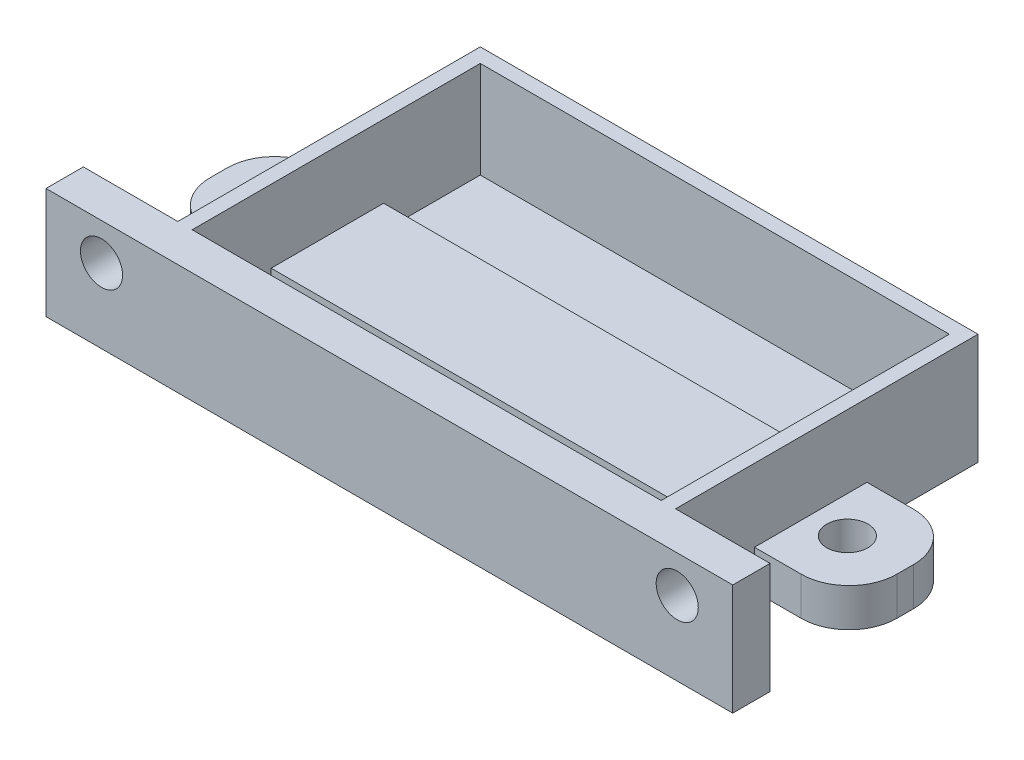
ISO-10303-21;
HEADER;
FILE_DESCRIPTION(('STEP AP214'),'2;1');
FILE_NAME('part.step','',(''),(''),'','','');
FILE_SCHEMA(('AUTOMOTIVE_DESIGN { 1 0 10303 214 1 1 1 1 }'));
ENDSEC;
DATA;
#1=APPLICATION_CONTEXT('core data for automotive mechanical design processes');
#2=APPLICATION_PROTOCOL_DEFINITION('international standard','automotive_design',2000,#1);
#3=PRODUCT_CONTEXT('',#1,'mechanical');
#4=PRODUCT('Part','Part','',(#3));
#5=PRODUCT_RELATED_PRODUCT_CATEGORY('part','',(#4));
#6=PRODUCT_DEFINITION_FORMATION('','',#4);
#7=PRODUCT_DEFINITION_CONTEXT('part definition',#1,'design');
#8=PRODUCT_DEFINITION('design','',#6,#7);
#9=PRODUCT_DEFINITION_SHAPE('','',#8);
#10=(LENGTH_UNIT() NAMED_UNIT(*) SI_UNIT(.MILLI.,.METRE.));
#11=(NAMED_UNIT(*) PLANE_ANGLE_UNIT() SI_UNIT($,.RADIAN.));
#12=(NAMED_UNIT(*) SI_UNIT($,.STERADIAN.) SOLID_ANGLE_UNIT());
#13=UNCERTAINTY_MEASURE_WITH_UNIT(LENGTH_MEASURE(1.E-05),#10,'distance_accuracy_value','');
#14=(GEOMETRIC_REPRESENTATION_CONTEXT(3) GLOBAL_UNCERTAINTY_ASSIGNED_CONTEXT((#13)) GLOBAL_UNIT_ASSIGNED_CONTEXT((#10,
#11,#12)) REPRESENTATION_CONTEXT('',''));
#15=CARTESIAN_POINT('',(0.,0.,0.));
#16=DIRECTION('',(0.,0.,1.));
#17=DIRECTION('',(1.,0.,0.));
#18=AXIS2_PLACEMENT_3D('',#15,#16,#17);
#19=CARTESIAN_POINT('',(0.,1.5,0.));
#20=DIRECTION('',(0.,1.,0.));
#21=DIRECTION('',(0.,0.,1.));
#22=AXIS2_PLACEMENT_3D('',#19,#20,#21);
#23=PLANE('',#22);
#24=DIRECTION('',(1.,0.,0.));
#25=VECTOR('',#24,1.);
#26=CARTESIAN_POINT('',(0.,1.5,5.59999999999999));
#27=LINE('',#26,#25);
#28=CARTESIAN_POINT('',(-24.5,1.5,5.59999999999999));
#29=VERTEX_POINT('',#28);
#30=CARTESIAN_POINT('',(24.5,1.5,5.59999999999999));
#31=VERTEX_POINT('',#30);
#32=EDGE_CURVE('E280',#29,#31,#27,.T.);
#33=ORIENTED_EDGE('',*,*,#32,.F.);
#34=DIRECTION('',(0.,0.,1.));
#35=VECTOR('',#34,1.);
#36=CARTESIAN_POINT('',(-24.5,1.5,17.75));
#37=LINE('',#36,#35);
#38=CARTESIAN_POINT('',(-24.5,1.5,13.85));
#39=VERTEX_POINT('',#38);
#40=EDGE_CURVE('E345',#29,#39,#37,.T.);
#41=ORIENTED_EDGE('',*,*,#40,.T.);
#42=DIRECTION('',(1.,0.,0.));
#43=VECTOR('',#42,1.);
#44=CARTESIAN_POINT('',(0.,1.5,13.85));
#45=LINE('',#44,#43);
#46=CARTESIAN_POINT('',(24.5,1.5,13.85));
#47=VERTEX_POINT('',#46);
#48=EDGE_CURVE('E387',#39,#47,#45,.T.);
#49=ORIENTED_EDGE('',*,*,#48,.T.);
#50=DIRECTION('',(0.,0.,-1.));
#51=VECTOR('',#50,1.);
#52=CARTESIAN_POINT('',(24.5,1.5,17.75));
#53=LINE('',#52,#51);
#54=EDGE_CURVE('E354',#47,#31,#53,.T.);
#55=ORIENTED_EDGE('',*,*,#54,.T.);
#56=EDGE_LOOP('',(#33,#41,#49,#55));
#57=FACE_BOUND('',#56,.T.);
#58=ADVANCED_FACE('F37',(#57),#23,.T.);
#59=CARTESIAN_POINT('',(-26.,11.6,17.75));
#60=DIRECTION('',(1.,0.,0.));
#61=DIRECTION('',(0.,0.,-1.));
#62=AXIS2_PLACEMENT_3D('',#59,#60,#61);
#63=PLANE('',#62);
#64=DIRECTION('',(0.,0.,-1.));
#65=VECTOR('',#64,1.);
#66=CARTESIAN_POINT('',(-26.,4.,17.75));
#67=LINE('',#66,#65);
#68=CARTESIAN_POINT('',(-26.,4.,5.6));
#69=VERTEX_POINT('',#68);
#70=CARTESIAN_POINT('',(-26.,4.,-6.15000000000001));
#71=VERTEX_POINT('',#70);
#72=EDGE_CURVE('E297',#69,#71,#67,.T.);
#73=ORIENTED_EDGE('',*,*,#72,.F.);
#74=DIRECTION('',(0.,-1.,0.));
#75=VECTOR('',#74,1.);
#76=CARTESIAN_POINT('',(-26.,11.6,5.59999999999999));
#77=LINE('',#76,#75);
#78=CARTESIAN_POINT('',(-26.,0.,5.59999999999999));
#79=VERTEX_POINT('',#78);
#80=EDGE_CURVE('E291',#69,#79,#77,.T.);
#81=ORIENTED_EDGE('',*,*,#80,.T.);
#82=DIRECTION('',(0.,0.,1.));
#83=VECTOR('',#82,1.);
#84=CARTESIAN_POINT('',(-26.,0.,17.75));
#85=LINE('',#84,#83);
#86=CARTESIAN_POINT('',(-26.,0.,13.85));
#87=VERTEX_POINT('',#86);
#88=EDGE_CURVE('E360',#79,#87,#85,.T.);
#89=ORIENTED_EDGE('',*,*,#88,.T.);
#90=DIRECTION('',(0.,-1.,0.));
#91=VECTOR('',#90,1.);
#92=CARTESIAN_POINT('',(-26.,11.6,13.85));
#93=LINE('',#92,#91);
#94=CARTESIAN_POINT('',(-26.,11.6,13.85));
#95=VERTEX_POINT('',#94);
#96=EDGE_CURVE('E342',#95,#87,#93,.T.);
#97=ORIENTED_EDGE('',*,*,#96,.F.);
#98=DIRECTION('',(0.,0.,1.));
#99=VECTOR('',#98,1.);
#100=CARTESIAN_POINT('',(-26.,11.6,17.75));
#101=LINE('',#100,#99);
#102=CARTESIAN_POINT('',(-26.,11.6,-17.75));
#103=VERTEX_POINT('',#102);
#104=EDGE_CURVE('E368',#103,#95,#101,.T.);
#105=ORIENTED_EDGE('',*,*,#104,.F.);
#106=DIRECTION('',(0.,-1.,0.));
#107=VECTOR('',#106,1.);
#108=CARTESIAN_POINT('',(-26.,11.6,-17.75));
#109=LINE('',#108,#107);
#110=CARTESIAN_POINT('',(-26.,0.,-17.75));
#111=VERTEX_POINT('',#110);
#112=EDGE_CURVE('E377',#103,#111,#109,.T.);
#113=ORIENTED_EDGE('',*,*,#112,.T.);
#114=CARTESIAN_POINT('',(-26.,0.,-6.15000000000001));
#115=VERTEX_POINT('',#114);
#116=EDGE_CURVE('E378',#111,#115,#85,.T.);
#117=ORIENTED_EDGE('',*,*,#116,.T.);
#118=DIRECTION('',(0.,1.,0.));
#119=VECTOR('',#118,1.);
#120=CARTESIAN_POINT('',(-26.,11.6,-6.15000000000001));
#121=LINE('',#120,#119);
#122=EDGE_CURVE('E248',#115,#71,#121,.T.);
#123=ORIENTED_EDGE('',*,*,#122,.T.);
#124=EDGE_LOOP('',(#73,#81,#89,#97,#105,#113,#117,#123));
#125=FACE_BOUND('',#124,.T.);
#126=ADVANCED_FACE('F479',(#125),#63,.F.);
#127=CARTESIAN_POINT('',(26.,11.6,17.75));
#128=DIRECTION('',(-1.,0.,0.));
#129=DIRECTION('',(0.,0.,1.));
#130=AXIS2_PLACEMENT_3D('',#127,#128,#129);
#131=PLANE('',#130);
#132=DIRECTION('',(0.,0.,-1.));
#133=VECTOR('',#132,1.);
#134=CARTESIAN_POINT('',(26.,0.,17.75));
#135=LINE('',#134,#133);
#136=CARTESIAN_POINT('',(26.,0.,13.85));
#137=VERTEX_POINT('',#136);
#138=CARTESIAN_POINT('',(26.,0.,5.59999999999999));
#139=VERTEX_POINT('',#138);
#140=EDGE_CURVE('E235',#137,#139,#135,.T.);
#141=ORIENTED_EDGE('',*,*,#140,.T.);
#142=DIRECTION('',(0.,1.,0.));
#143=VECTOR('',#142,1.);
#144=CARTESIAN_POINT('',(26.,11.6,5.6));
#145=LINE('',#144,#143);
#146=CARTESIAN_POINT('',(26.,4.,5.6));
#147=VERTEX_POINT('',#146);
#148=EDGE_CURVE('E289',#139,#147,#145,.T.);
#149=ORIENTED_EDGE('',*,*,#148,.T.);
#150=DIRECTION('',(0.,0.,1.));
#151=VECTOR('',#150,1.);
#152=CARTESIAN_POINT('',(26.,4.,17.75));
#153=LINE('',#152,#151);
#154=CARTESIAN_POINT('',(26.,4.,-6.15000000000001));
#155=VERTEX_POINT('',#154);
#156=EDGE_CURVE('E244',#155,#147,#153,.T.);
#157=ORIENTED_EDGE('',*,*,#156,.F.);
#158=DIRECTION('',(0.,-1.,0.));
#159=VECTOR('',#158,1.);
#160=CARTESIAN_POINT('',(26.,11.6,-6.15));
#161=LINE('',#160,#159);
#162=CARTESIAN_POINT('',(26.,0.,-6.15));
#163=VERTEX_POINT('',#162);
#164=EDGE_CURVE('E239',#155,#163,#161,.T.);
#165=ORIENTED_EDGE('',*,*,#164,.T.);
#166=CARTESIAN_POINT('',(26.,0.,-17.75));
#167=VERTEX_POINT('',#166);
#168=EDGE_CURVE('E224',#163,#167,#135,.T.);
#169=ORIENTED_EDGE('',*,*,#168,.T.);
#170=DIRECTION('',(0.,-1.,0.));
#171=VECTOR('',#170,1.);
#172=CARTESIAN_POINT('',(26.,11.6,-17.75));
#173=LINE('',#172,#171);
#174=CARTESIAN_POINT('',(26.,11.6,-17.75));
#175=VERTEX_POINT('',#174);
#176=EDGE_CURVE('E385',#175,#167,#173,.T.);
#177=ORIENTED_EDGE('',*,*,#176,.F.);
#178=DIRECTION('',(0.,0.,-1.));
#179=VECTOR('',#178,1.);
#180=CARTESIAN_POINT('',(26.,11.6,17.75));
#181=LINE('',#180,#179);
#182=CARTESIAN_POINT('',(26.,11.6,13.85));
#183=VERTEX_POINT('',#182);
#184=EDGE_CURVE('E373',#183,#175,#181,.T.);
#185=ORIENTED_EDGE('',*,*,#184,.F.);
#186=DIRECTION('',(0.,1.,0.));
#187=VECTOR('',#186,1.);
#188=CARTESIAN_POINT('',(26.,11.6,13.85));
#189=LINE('',#188,#187);
#190=EDGE_CURVE('E339',#137,#183,#189,.T.);
#191=ORIENTED_EDGE('',*,*,#190,.F.);
#192=EDGE_LOOP('',(#141,#149,#157,#165,#169,#177,#185,#191));
#193=FACE_BOUND('',#192,.T.);
#194=ADVANCED_FACE('F241',(#193),#131,.F.);
#195=CARTESIAN_POINT('',(-24.5,11.6,17.75));
#196=DIRECTION('',(1.,0.,0.));
#197=DIRECTION('',(0.,0.,-1.));
#198=AXIS2_PLACEMENT_3D('',#195,#196,#197);
#199=PLANE('',#198);
#200=DIRECTION('',(0.,-1.,0.));
#201=VECTOR('',#200,1.);
#202=CARTESIAN_POINT('',(-24.5,11.6,5.59999999999999));
#203=LINE('',#202,#201);
#204=CARTESIAN_POINT('',(-24.5,4.,5.6));
#205=VERTEX_POINT('',#204);
#206=EDGE_CURVE('E286',#205,#29,#203,.T.);
#207=ORIENTED_EDGE('',*,*,#206,.F.);
#208=DIRECTION('',(0.,0.,-1.));
#209=VECTOR('',#208,1.);
#210=CARTESIAN_POINT('',(-24.5,4.,17.75));
#211=LINE('',#210,#209);
#212=CARTESIAN_POINT('',(-24.5,4.,-6.15000000000001));
#213=VERTEX_POINT('',#212);
#214=EDGE_CURVE('E294',#205,#213,#211,.T.);
#215=ORIENTED_EDGE('',*,*,#214,.T.);
#216=DIRECTION('',(0.,1.,0.));
#217=VECTOR('',#216,1.);
#218=CARTESIAN_POINT('',(-24.5,11.6,-6.15000000000001));
#219=LINE('',#218,#217);
#220=CARTESIAN_POINT('',(-24.5,1.5,-6.15000000000001));
#221=VERTEX_POINT('',#220);
#222=EDGE_CURVE('E249',#221,#213,#219,.T.);
#223=ORIENTED_EDGE('',*,*,#222,.F.);
#224=CARTESIAN_POINT('',(-24.5,1.5,-16.25));
#225=VERTEX_POINT('',#224);
#226=EDGE_CURVE('E346',#225,#221,#37,.T.);
#227=ORIENTED_EDGE('',*,*,#226,.F.);
#228=DIRECTION('',(0.,-1.,0.));
#229=VECTOR('',#228,1.);
#230=CARTESIAN_POINT('',(-24.5,11.6,-16.25));
#231=LINE('',#230,#229);
#232=CARTESIAN_POINT('',(-24.5,11.6,-16.25));
#233=VERTEX_POINT('',#232);
#234=EDGE_CURVE('E349',#233,#225,#231,.T.);
#235=ORIENTED_EDGE('',*,*,#234,.F.);
#236=DIRECTION('',(0.,0.,1.));
#237=VECTOR('',#236,1.);
#238=CARTESIAN_POINT('',(-24.5,11.6,17.75));
#239=LINE('',#238,#237);
#240=CARTESIAN_POINT('',(-24.5,11.6,13.85));
#241=VERTEX_POINT('',#240);
#242=EDGE_CURVE('E362',#233,#241,#239,.T.);
#243=ORIENTED_EDGE('',*,*,#242,.T.);
#244=DIRECTION('',(0.,-1.,0.));
#245=VECTOR('',#244,1.);
#246=CARTESIAN_POINT('',(-24.5,11.6,13.85));
#247=LINE('',#246,#245);
#248=EDGE_CURVE('E336',#241,#39,#247,.T.);
#249=ORIENTED_EDGE('',*,*,#248,.T.);
#250=ORIENTED_EDGE('',*,*,#40,.F.);
#251=EDGE_LOOP('',(#207,#215,#223,#227,#235,#243,#249,#250));
#252=FACE_BOUND('',#251,.T.);
#253=ADVANCED_FACE('F521',(#252),#199,.T.);
#254=CARTESIAN_POINT('',(24.5,11.6,17.75));
#255=DIRECTION('',(-1.,0.,0.));
#256=DIRECTION('',(0.,0.,1.));
#257=AXIS2_PLACEMENT_3D('',#254,#255,#256);
#258=PLANE('',#257);
#259=DIRECTION('',(0.,1.,0.));
#260=VECTOR('',#259,1.);
#261=CARTESIAN_POINT('',(24.5,11.6,5.6));
#262=LINE('',#261,#260);
#263=CARTESIAN_POINT('',(24.5,4.,5.6));
#264=VERTEX_POINT('',#263);
#265=EDGE_CURVE('E283',#31,#264,#262,.T.);
#266=ORIENTED_EDGE('',*,*,#265,.F.);
#267=ORIENTED_EDGE('',*,*,#54,.F.);
#268=DIRECTION('',(0.,1.,0.));
#269=VECTOR('',#268,1.);
#270=CARTESIAN_POINT('',(24.5,11.6,13.85));
#271=LINE('',#270,#269);
#272=CARTESIAN_POINT('',(24.5,11.6,13.85));
#273=VERTEX_POINT('',#272);
#274=EDGE_CURVE('E325',#47,#273,#271,.T.);
#275=ORIENTED_EDGE('',*,*,#274,.T.);
#276=DIRECTION('',(0.,0.,-1.));
#277=VECTOR('',#276,1.);
#278=CARTESIAN_POINT('',(24.5,11.6,17.75));
#279=LINE('',#278,#277);
#280=CARTESIAN_POINT('',(24.5,11.6,-16.25));
#281=VERTEX_POINT('',#280);
#282=EDGE_CURVE('E365',#273,#281,#279,.T.);
#283=ORIENTED_EDGE('',*,*,#282,.T.);
#284=DIRECTION('',(0.,-1.,0.));
#285=VECTOR('',#284,1.);
#286=CARTESIAN_POINT('',(24.5,11.6,-16.25));
#287=LINE('',#286,#285);
#288=CARTESIAN_POINT('',(24.5,1.5,-16.25));
#289=VERTEX_POINT('',#288);
#290=EDGE_CURVE('E352',#281,#289,#287,.T.);
#291=ORIENTED_EDGE('',*,*,#290,.T.);
#292=CARTESIAN_POINT('',(24.5,1.5,-6.15000000000001));
#293=VERTEX_POINT('',#292);
#294=EDGE_CURVE('E348',#293,#289,#53,.T.);
#295=ORIENTED_EDGE('',*,*,#294,.F.);
#296=DIRECTION('',(0.,-1.,0.));
#297=VECTOR('',#296,1.);
#298=CARTESIAN_POINT('',(24.5,11.6,-6.15));
#299=LINE('',#298,#297);
#300=CARTESIAN_POINT('',(24.5,4.,-6.15000000000001));
#301=VERTEX_POINT('',#300);
#302=EDGE_CURVE('E272',#301,#293,#299,.T.);
#303=ORIENTED_EDGE('',*,*,#302,.F.);
#304=DIRECTION('',(0.,0.,1.));
#305=VECTOR('',#304,1.);
#306=CARTESIAN_POINT('',(24.5,4.,17.75));
#307=LINE('',#306,#305);
#308=EDGE_CURVE('E390',#301,#264,#307,.T.);
#309=ORIENTED_EDGE('',*,*,#308,.T.);
#310=EDGE_LOOP('',(#266,#267,#275,#283,#291,#295,#303,#309));
#311=FACE_BOUND('',#310,.T.);
#312=ADVANCED_FACE('F512',(#311),#258,.T.);
#313=DIRECTION('',(-1.,0.,0.));
#314=VECTOR('',#313,1.);
#315=CARTESIAN_POINT('',(0.,1.5,-6.15000000000001));
#316=LINE('',#315,#314);
#317=EDGE_CURVE('E269',#293,#221,#316,.T.);
#318=ORIENTED_EDGE('',*,*,#317,.F.);
#319=ORIENTED_EDGE('',*,*,#294,.T.);
#320=DIRECTION('',(-1.,0.,0.));
#321=VECTOR('',#320,1.);
#322=CARTESIAN_POINT('',(26.,1.5,-16.25));
#323=LINE('',#322,#321);
#324=EDGE_CURVE('E357',#289,#225,#323,.T.);
#325=ORIENTED_EDGE('',*,*,#324,.T.);
#326=ORIENTED_EDGE('',*,*,#226,.T.);
#327=EDGE_LOOP('',(#318,#319,#325,#326));
#328=FACE_BOUND('',#327,.T.);
#329=ADVANCED_FACE('F503',(#328),#23,.T.);
#330=CARTESIAN_POINT('',(26.,11.6,17.75));
#331=DIRECTION('',(0.,0.,-1.));
#332=DIRECTION('',(-1.,0.,0.));
#333=AXIS2_PLACEMENT_3D('',#330,#331,#332);
#334=PLANE('',#333);
#335=CARTESIAN_POINT('',(-30.0750000000001,7.75,17.75));
#336=DIRECTION('',(0.,0.,1.));
#337=DIRECTION('',(1.,0.,0.));
#338=AXIS2_PLACEMENT_3D('',#335,#336,#337);
#339=CIRCLE('',#338,2.2);
#340=CARTESIAN_POINT('',(-27.8750000000001,7.75,17.75));
#341=VERTEX_POINT('',#340);
#342=EDGE_CURVE('E423',#341,#341,#339,.T.);
#343=ORIENTED_EDGE('',*,*,#342,.F.);
#344=EDGE_LOOP('',(#343));
#345=FACE_BOUND('',#344,.T.);
#346=CARTESIAN_POINT('',(30.0750000000001,7.75,17.75));
#347=DIRECTION('',(0.,0.,1.));
#348=DIRECTION('',(1.,0.,0.));
#349=AXIS2_PLACEMENT_3D('',#346,#347,#348);
#350=CIRCLE('',#349,2.19999999999999);
#351=CARTESIAN_POINT('',(32.2750000000001,7.75,17.75));
#352=VERTEX_POINT('',#351);
#353=EDGE_CURVE('E429',#352,#352,#350,.T.);
#354=ORIENTED_EDGE('',*,*,#353,.F.);
#355=EDGE_LOOP('',(#354));
#356=FACE_BOUND('',#355,.T.);
#357=DIRECTION('',(1.,0.,0.));
#358=VECTOR('',#357,1.);
#359=CARTESIAN_POINT('',(26.,0.,17.75));
#360=LINE('',#359,#358);
#361=CARTESIAN_POINT('',(-35.875,0.,17.75));
#362=VERTEX_POINT('',#361);
#363=CARTESIAN_POINT('',(35.875,0.,17.75));
#364=VERTEX_POINT('',#363);
#365=EDGE_CURVE('E236',#362,#364,#360,.T.);
#366=ORIENTED_EDGE('',*,*,#365,.T.);
#367=DIRECTION('',(0.,1.,0.));
#368=VECTOR('',#367,1.);
#369=CARTESIAN_POINT('',(35.875,0.,17.75));
#370=LINE('',#369,#368);
#371=CARTESIAN_POINT('',(35.875,11.6,17.75));
#372=VERTEX_POINT('',#371);
#373=EDGE_CURVE('E305',#364,#372,#370,.T.);
#374=ORIENTED_EDGE('',*,*,#373,.T.);
#375=DIRECTION('',(1.,0.,0.));
#376=VECTOR('',#375,1.);
#377=CARTESIAN_POINT('',(26.,11.6,17.75));
#378=LINE('',#377,#376);
#379=CARTESIAN_POINT('',(-35.875,11.6,17.75));
#380=VERTEX_POINT('',#379);
#381=EDGE_CURVE('E371',#380,#372,#378,.T.);
#382=ORIENTED_EDGE('',*,*,#381,.F.);
#383=DIRECTION('',(0.,-1.,0.));
#384=VECTOR('',#383,1.);
#385=CARTESIAN_POINT('',(-35.875,0.,17.75));
#386=LINE('',#385,#384);
#387=EDGE_CURVE('E300',#380,#362,#386,.T.);
#388=ORIENTED_EDGE('',*,*,#387,.T.);
#389=EDGE_LOOP('',(#366,#374,#382,#388));
#390=FACE_BOUND('',#389,.T.);
#391=ADVANCED_FACE('F511',(#345,#356,#390),#334,.F.);
#392=CARTESIAN_POINT('',(26.,11.6,-17.75));
#393=DIRECTION('',(0.,0.,1.));
#394=DIRECTION('',(1.,0.,0.));
#395=AXIS2_PLACEMENT_3D('',#392,#393,#394);
#396=PLANE('',#395);
#397=DIRECTION('',(-1.,0.,0.));
#398=VECTOR('',#397,1.);
#399=CARTESIAN_POINT('',(26.,0.,-17.75));
#400=LINE('',#399,#398);
#401=EDGE_CURVE('E231',#167,#111,#400,.T.);
#402=ORIENTED_EDGE('',*,*,#401,.T.);
#403=ORIENTED_EDGE('',*,*,#112,.F.);
#404=DIRECTION('',(-1.,0.,0.));
#405=VECTOR('',#404,1.);
#406=CARTESIAN_POINT('',(26.,11.6,-17.75));
#407=LINE('',#406,#405);
#408=EDGE_CURVE('E375',#175,#103,#407,.T.);
#409=ORIENTED_EDGE('',*,*,#408,.F.);
#410=ORIENTED_EDGE('',*,*,#176,.T.);
#411=EDGE_LOOP('',(#402,#403,#409,#410));
#412=FACE_BOUND('',#411,.T.);
#413=ADVANCED_FACE('F518',(#412),#396,.F.);
#414=CARTESIAN_POINT('',(0.,11.6,0.));
#415=DIRECTION('',(0.,1.,0.));
#416=DIRECTION('',(0.,0.,1.));
#417=AXIS2_PLACEMENT_3D('',#414,#415,#416);
#418=PLANE('',#417);
#419=DIRECTION('',(-1.,0.,0.));
#420=VECTOR('',#419,1.);
#421=CARTESIAN_POINT('',(35.875,11.6,13.85));
#422=LINE('',#421,#420);
#423=EDGE_CURVE('E317',#273,#241,#422,.T.);
#424=ORIENTED_EDGE('',*,*,#423,.T.);
#425=ORIENTED_EDGE('',*,*,#242,.F.);
#426=DIRECTION('',(-1.,0.,0.));
#427=VECTOR('',#426,1.);
#428=CARTESIAN_POINT('',(26.,11.6,-16.25));
#429=LINE('',#428,#427);
#430=EDGE_CURVE('E353',#281,#233,#429,.T.);
#431=ORIENTED_EDGE('',*,*,#430,.F.);
#432=ORIENTED_EDGE('',*,*,#282,.F.);
#433=EDGE_LOOP('',(#424,#425,#431,#432));
#434=FACE_BOUND('',#433,.T.);
#435=ORIENTED_EDGE('',*,*,#104,.T.);
#436=CARTESIAN_POINT('',(-35.875,11.6,13.85));
#437=VERTEX_POINT('',#436);
#438=EDGE_CURVE('E312',#95,#437,#422,.T.);
#439=ORIENTED_EDGE('',*,*,#438,.T.);
#440=DIRECTION('',(0.,0.,1.));
#441=VECTOR('',#440,1.);
#442=CARTESIAN_POINT('',(-35.875,11.6,13.85));
#443=LINE('',#442,#441);
#444=EDGE_CURVE('E322',#437,#380,#443,.T.);
#445=ORIENTED_EDGE('',*,*,#444,.T.);
#446=ORIENTED_EDGE('',*,*,#381,.T.);
#447=DIRECTION('',(0.,0.,1.));
#448=VECTOR('',#447,1.);
#449=CARTESIAN_POINT('',(35.875,11.6,13.85));
#450=LINE('',#449,#448);
#451=CARTESIAN_POINT('',(35.875,11.6,13.85));
#452=VERTEX_POINT('',#451);
#453=EDGE_CURVE('E326',#452,#372,#450,.T.);
#454=ORIENTED_EDGE('',*,*,#453,.F.);
#455=EDGE_CURVE('E313',#452,#183,#422,.T.);
#456=ORIENTED_EDGE('',*,*,#455,.T.);
#457=ORIENTED_EDGE('',*,*,#184,.T.);
#458=ORIENTED_EDGE('',*,*,#408,.T.);
#459=EDGE_LOOP('',(#435,#439,#445,#446,#454,#456,#457,#458));
#460=FACE_BOUND('',#459,.T.);
#461=ADVANCED_FACE('F567',(#434,#460),#418,.T.);
#462=CARTESIAN_POINT('',(0.,0.,0.));
#463=DIRECTION('',(0.,1.,0.));
#464=DIRECTION('',(0.,0.,1.));
#465=AXIS2_PLACEMENT_3D('',#462,#463,#464);
#466=PLANE('',#465);
#467=CARTESIAN_POINT('',(-29.825,0.,-0.275000000000025));
#468=DIRECTION('',(0.,1.,0.));
#469=DIRECTION('',(0.,0.,1.));
#470=AXIS2_PLACEMENT_3D('',#467,#468,#469);
#471=CIRCLE('',#470,2.15);
#472=CARTESIAN_POINT('',(-29.825,0.,1.87499999999997));
#473=VERTEX_POINT('',#472);
#474=EDGE_CURVE('E260',#473,#473,#471,.T.);
#475=ORIENTED_EDGE('',*,*,#474,.T.);
#476=EDGE_LOOP('',(#475));
#477=FACE_BOUND('',#476,.T.);
#478=CARTESIAN_POINT('',(29.825,0.,-0.275000000000025));
#479=DIRECTION('',(0.,1.,0.));
#480=DIRECTION('',(0.,0.,1.));
#481=AXIS2_PLACEMENT_3D('',#478,#479,#480);
#482=CIRCLE('',#481,2.15);
#483=CARTESIAN_POINT('',(29.825,0.,1.87499999999998));
#484=VERTEX_POINT('',#483);
#485=EDGE_CURVE('E427',#484,#484,#482,.T.);
#486=ORIENTED_EDGE('',*,*,#485,.T.);
#487=EDGE_LOOP('',(#486));
#488=FACE_BOUND('',#487,.T.);
#489=DIRECTION('',(0.,0.,1.));
#490=VECTOR('',#489,1.);
#491=CARTESIAN_POINT('',(35.875,0.,-6.15));
#492=LINE('',#491,#490);
#493=CARTESIAN_POINT('',(35.875,0.,-1.15));
#494=VERTEX_POINT('',#493);
#495=CARTESIAN_POINT('',(35.875,0.,0.599999999999996));
#496=VERTEX_POINT('',#495);
#497=EDGE_CURVE('E258',#494,#496,#492,.T.);
#498=ORIENTED_EDGE('',*,*,#497,.T.);
#499=CARTESIAN_POINT('',(30.875,0.,0.599999999999996));
#500=DIRECTION('',(0.,1.,0.));
#501=DIRECTION('',(0.,0.,1.));
#502=AXIS2_PLACEMENT_3D('',#499,#500,#501);
#503=CIRCLE('',#502,5.);
#504=CARTESIAN_POINT('',(30.875,0.,5.6));
#505=VERTEX_POINT('',#504);
#506=EDGE_CURVE('E403',#496,#505,#503,.F.);
#507=ORIENTED_EDGE('',*,*,#506,.T.);
#508=DIRECTION('',(-1.,0.,0.));
#509=VECTOR('',#508,1.);
#510=CARTESIAN_POINT('',(35.875,0.,5.6));
#511=LINE('',#510,#509);
#512=EDGE_CURVE('E266',#505,#139,#511,.T.);
#513=ORIENTED_EDGE('',*,*,#512,.T.);
#514=ORIENTED_EDGE('',*,*,#140,.F.);
#515=DIRECTION('',(1.,0.,0.));
#516=VECTOR('',#515,1.);
#517=CARTESIAN_POINT('',(35.875,0.,13.85));
#518=LINE('',#517,#516);
#519=CARTESIAN_POINT('',(35.875,0.,13.85));
#520=VERTEX_POINT('',#519);
#521=EDGE_CURVE('E304',#137,#520,#518,.T.);
#522=ORIENTED_EDGE('',*,*,#521,.T.);
#523=DIRECTION('',(0.,0.,1.));
#524=VECTOR('',#523,1.);
#525=CARTESIAN_POINT('',(35.875,0.,13.85));
#526=LINE('',#525,#524);
#527=EDGE_CURVE('E329',#520,#364,#526,.T.);
#528=ORIENTED_EDGE('',*,*,#527,.T.);
#529=ORIENTED_EDGE('',*,*,#365,.F.);
#530=DIRECTION('',(0.,0.,1.));
#531=VECTOR('',#530,1.);
#532=CARTESIAN_POINT('',(-35.875,0.,13.85));
#533=LINE('',#532,#531);
#534=CARTESIAN_POINT('',(-35.875,0.,13.85));
#535=VERTEX_POINT('',#534);
#536=EDGE_CURVE('E316',#535,#362,#533,.T.);
#537=ORIENTED_EDGE('',*,*,#536,.F.);
#538=EDGE_CURVE('E306',#535,#87,#518,.T.);
#539=ORIENTED_EDGE('',*,*,#538,.T.);
#540=ORIENTED_EDGE('',*,*,#88,.F.);
#541=CARTESIAN_POINT('',(-30.875,0.,5.59999999999999));
#542=VERTEX_POINT('',#541);
#543=EDGE_CURVE('E265',#79,#542,#511,.T.);
#544=ORIENTED_EDGE('',*,*,#543,.T.);
#545=CARTESIAN_POINT('',(-30.875,0.,0.599999999999989));
#546=DIRECTION('',(0.,1.,0.));
#547=DIRECTION('',(0.,0.,1.));
#548=AXIS2_PLACEMENT_3D('',#545,#546,#547);
#549=CIRCLE('',#548,5.);
#550=CARTESIAN_POINT('',(-35.875,0.,0.599999999999989));
#551=VERTEX_POINT('',#550);
#552=EDGE_CURVE('E399',#542,#551,#549,.F.);
#553=ORIENTED_EDGE('',*,*,#552,.T.);
#554=DIRECTION('',(0.,0.,-1.));
#555=VECTOR('',#554,1.);
#556=CARTESIAN_POINT('',(-35.875,0.,-6.15000000000001));
#557=LINE('',#556,#555);
#558=CARTESIAN_POINT('',(-35.875,0.,-1.15000000000001));
#559=VERTEX_POINT('',#558);
#560=EDGE_CURVE('E256',#551,#559,#557,.T.);
#561=ORIENTED_EDGE('',*,*,#560,.T.);
#562=CARTESIAN_POINT('',(-30.875,0.,-1.15000000000001));
#563=DIRECTION('',(0.,1.,0.));
#564=DIRECTION('',(0.,0.,1.));
#565=AXIS2_PLACEMENT_3D('',#562,#563,#564);
#566=CIRCLE('',#565,5.);
#567=CARTESIAN_POINT('',(-30.875,0.,-6.15000000000001));
#568=VERTEX_POINT('',#567);
#569=EDGE_CURVE('E397',#559,#568,#566,.F.);
#570=ORIENTED_EDGE('',*,*,#569,.T.);
#571=DIRECTION('',(1.,0.,0.));
#572=VECTOR('',#571,1.);
#573=CARTESIAN_POINT('',(35.875,0.,-6.15));
#574=LINE('',#573,#572);
#575=EDGE_CURVE('E255',#568,#115,#574,.T.);
#576=ORIENTED_EDGE('',*,*,#575,.T.);
#577=ORIENTED_EDGE('',*,*,#116,.F.);
#578=ORIENTED_EDGE('',*,*,#401,.F.);
#579=ORIENTED_EDGE('',*,*,#168,.F.);
#580=CARTESIAN_POINT('',(30.875,0.,-6.15));
#581=VERTEX_POINT('',#580);
#582=EDGE_CURVE('E229',#163,#581,#574,.T.);
#583=ORIENTED_EDGE('',*,*,#582,.T.);
#584=CARTESIAN_POINT('',(30.875,0.,-1.15));
#585=DIRECTION('',(0.,1.,0.));
#586=DIRECTION('',(0.,0.,1.));
#587=AXIS2_PLACEMENT_3D('',#584,#585,#586);
#588=CIRCLE('',#587,5.);
#589=EDGE_CURVE('E401',#581,#494,#588,.F.);
#590=ORIENTED_EDGE('',*,*,#589,.T.);
#591=EDGE_LOOP('',(#498,#507,#513,#514,#522,#528,#529,#537,#539,#540,#544,#553,#561,#570,#576,
#577,#578,#579,#583,#590));
#592=FACE_BOUND('',#591,.T.);
#593=ADVANCED_FACE('F227',(#477,#488,#592),#466,.F.);
#594=CARTESIAN_POINT('',(26.,11.6,-16.25));
#595=DIRECTION('',(0.,0.,1.));
#596=DIRECTION('',(1.,0.,0.));
#597=AXIS2_PLACEMENT_3D('',#594,#595,#596);
#598=PLANE('',#597);
#599=ORIENTED_EDGE('',*,*,#324,.F.);
#600=ORIENTED_EDGE('',*,*,#290,.F.);
#601=ORIENTED_EDGE('',*,*,#430,.T.);
#602=ORIENTED_EDGE('',*,*,#234,.T.);
#603=EDGE_LOOP('',(#599,#600,#601,#602));
#604=FACE_BOUND('',#603,.T.);
#605=ADVANCED_FACE('F765',(#604),#598,.T.);
#606=CARTESIAN_POINT('',(0.,0.,13.85));
#607=DIRECTION('',(0.,0.,1.));
#608=DIRECTION('',(1.,0.,0.));
#609=AXIS2_PLACEMENT_3D('',#606,#607,#608);
#610=PLANE('',#609);
#611=ORIENTED_EDGE('',*,*,#248,.F.);
#612=ORIENTED_EDGE('',*,*,#423,.F.);
#613=ORIENTED_EDGE('',*,*,#274,.F.);
#614=ORIENTED_EDGE('',*,*,#48,.F.);
#615=EDGE_LOOP('',(#611,#612,#613,#614));
#616=FACE_BOUND('',#615,.T.);
#617=ADVANCED_FACE('F795',(#616),#610,.F.);
#618=CARTESIAN_POINT('',(35.875,0.,13.85));
#619=DIRECTION('',(1.,0.,0.));
#620=DIRECTION('',(0.,0.,-1.));
#621=AXIS2_PLACEMENT_3D('',#618,#619,#620);
#622=PLANE('',#621);
#623=ORIENTED_EDGE('',*,*,#373,.F.);
#624=ORIENTED_EDGE('',*,*,#527,.F.);
#625=DIRECTION('',(0.,1.,0.));
#626=VECTOR('',#625,1.);
#627=CARTESIAN_POINT('',(35.875,0.,13.85));
#628=LINE('',#627,#626);
#629=EDGE_CURVE('E309',#520,#452,#628,.T.);
#630=ORIENTED_EDGE('',*,*,#629,.T.);
#631=ORIENTED_EDGE('',*,*,#453,.T.);
#632=EDGE_LOOP('',(#623,#624,#630,#631));
#633=FACE_BOUND('',#632,.T.);
#634=ADVANCED_FACE('F558',(#633),#622,.T.);
#635=CARTESIAN_POINT('',(30.0750000000001,7.75,13.85));
#636=DIRECTION('',(0.,0.,1.));
#637=DIRECTION('',(1.,0.,0.));
#638=AXIS2_PLACEMENT_3D('',#635,#636,#637);
#639=CIRCLE('',#638,2.19999999999999);
#640=CARTESIAN_POINT('',(32.2750000000001,7.75,13.85));
#641=VERTEX_POINT('',#640);
#642=EDGE_CURVE('E41',#641,#641,#639,.T.);
#643=ORIENTED_EDGE('',*,*,#642,.T.);
#644=EDGE_LOOP('',(#643));
#645=FACE_BOUND('',#644,.T.);
#646=ORIENTED_EDGE('',*,*,#521,.F.);
#647=ORIENTED_EDGE('',*,*,#190,.T.);
#648=ORIENTED_EDGE('',*,*,#455,.F.);
#649=ORIENTED_EDGE('',*,*,#629,.F.);
#650=EDGE_LOOP('',(#646,#647,#648,#649));
#651=FACE_BOUND('',#650,.T.);
#652=ADVANCED_FACE('F554',(#645,#651),#610,.F.);
#653=CARTESIAN_POINT('',(-30.0750000000001,7.75,13.85));
#654=DIRECTION('',(0.,0.,1.));
#655=DIRECTION('',(1.,0.,0.));
#656=AXIS2_PLACEMENT_3D('',#653,#654,#655);
#657=CIRCLE('',#656,2.2);
#658=CARTESIAN_POINT('',(-27.8750000000001,7.75,13.85));
#659=VERTEX_POINT('',#658);
#660=EDGE_CURVE('E421',#659,#659,#657,.T.);
#661=ORIENTED_EDGE('',*,*,#660,.T.);
#662=EDGE_LOOP('',(#661));
#663=FACE_BOUND('',#662,.T.);
#664=ORIENTED_EDGE('',*,*,#438,.F.);
#665=ORIENTED_EDGE('',*,*,#96,.T.);
#666=ORIENTED_EDGE('',*,*,#538,.F.);
#667=DIRECTION('',(0.,-1.,0.));
#668=VECTOR('',#667,1.);
#669=CARTESIAN_POINT('',(-35.875,0.,13.85));
#670=LINE('',#669,#668);
#671=EDGE_CURVE('E301',#437,#535,#670,.T.);
#672=ORIENTED_EDGE('',*,*,#671,.F.);
#673=EDGE_LOOP('',(#664,#665,#666,#672));
#674=FACE_BOUND('',#673,.T.);
#675=ADVANCED_FACE('F569',(#663,#674),#610,.F.);
#676=CARTESIAN_POINT('',(-35.875,0.,13.85));
#677=DIRECTION('',(-1.,0.,0.));
#678=DIRECTION('',(0.,0.,1.));
#679=AXIS2_PLACEMENT_3D('',#676,#677,#678);
#680=PLANE('',#679);
#681=ORIENTED_EDGE('',*,*,#387,.F.);
#682=ORIENTED_EDGE('',*,*,#444,.F.);
#683=ORIENTED_EDGE('',*,*,#671,.T.);
#684=ORIENTED_EDGE('',*,*,#536,.T.);
#685=EDGE_LOOP('',(#681,#682,#683,#684));
#686=FACE_BOUND('',#685,.T.);
#687=ADVANCED_FACE('F563',(#686),#680,.T.);
#688=CARTESIAN_POINT('',(35.875,4.,-6.15));
#689=DIRECTION('',(0.,0.,-1.));
#690=DIRECTION('',(-1.,0.,0.));
#691=AXIS2_PLACEMENT_3D('',#688,#689,#690);
#692=PLANE('',#691);
#693=ORIENTED_EDGE('',*,*,#317,.T.);
#694=ORIENTED_EDGE('',*,*,#222,.T.);
#695=DIRECTION('',(1.,0.,0.));
#696=VECTOR('',#695,1.);
#697=CARTESIAN_POINT('',(35.875,4.,-6.15));
#698=LINE('',#697,#696);
#699=EDGE_CURVE('E451',#213,#301,#698,.T.);
#700=ORIENTED_EDGE('',*,*,#699,.T.);
#701=ORIENTED_EDGE('',*,*,#302,.T.);
#702=EDGE_LOOP('',(#693,#694,#700,#701));
#703=FACE_BOUND('',#702,.T.);
#704=ADVANCED_FACE('F532',(#703),#692,.T.);
#705=CARTESIAN_POINT('',(35.875,4.,5.6));
#706=DIRECTION('',(0.,0.,1.));
#707=DIRECTION('',(1.,0.,0.));
#708=AXIS2_PLACEMENT_3D('',#705,#706,#707);
#709=PLANE('',#708);
#710=DIRECTION('',(-1.,0.,0.));
#711=VECTOR('',#710,1.);
#712=CARTESIAN_POINT('',(35.875,4.,5.6));
#713=LINE('',#712,#711);
#714=EDGE_CURVE('E454',#264,#205,#713,.T.);
#715=ORIENTED_EDGE('',*,*,#714,.T.);
#716=ORIENTED_EDGE('',*,*,#206,.T.);
#717=ORIENTED_EDGE('',*,*,#32,.T.);
#718=ORIENTED_EDGE('',*,*,#265,.T.);
#719=EDGE_LOOP('',(#715,#716,#717,#718));
#720=FACE_BOUND('',#719,.T.);
#721=ADVANCED_FACE('F492',(#720),#709,.T.);
#722=CARTESIAN_POINT('',(0.,4.,0.));
#723=DIRECTION('',(0.,-1.,0.));
#724=DIRECTION('',(0.,0.,-1.));
#725=AXIS2_PLACEMENT_3D('',#722,#723,#724);
#726=PLANE('',#725);
#727=ORIENTED_EDGE('',*,*,#214,.F.);
#728=ORIENTED_EDGE('',*,*,#714,.F.);
#729=ORIENTED_EDGE('',*,*,#308,.F.);
#730=ORIENTED_EDGE('',*,*,#699,.F.);
#731=EDGE_LOOP('',(#727,#728,#729,#730));
#732=FACE_BOUND('',#731,.T.);
#733=ADVANCED_FACE('F486',(#732),#726,.F.);
#734=CARTESIAN_POINT('',(35.875,4.,-6.15));
#735=DIRECTION('',(1.,0.,0.));
#736=DIRECTION('',(0.,0.,-1.));
#737=AXIS2_PLACEMENT_3D('',#734,#735,#736);
#738=PLANE('',#737);
#739=DIRECTION('',(0.,0.,1.));
#740=VECTOR('',#739,1.);
#741=CARTESIAN_POINT('',(35.875,4.,-6.15));
#742=LINE('',#741,#740);
#743=CARTESIAN_POINT('',(35.875,4.,-1.15));
#744=VERTEX_POINT('',#743);
#745=CARTESIAN_POINT('',(35.875,4.,0.599999999999996));
#746=VERTEX_POINT('',#745);
#747=EDGE_CURVE('E450',#744,#746,#742,.T.);
#748=ORIENTED_EDGE('',*,*,#747,.T.);
#749=DIRECTION('',(0.,-1.,0.));
#750=VECTOR('',#749,1.);
#751=CARTESIAN_POINT('',(35.875,4.,0.599999999999996));
#752=LINE('',#751,#750);
#753=EDGE_CURVE('E394',#746,#496,#752,.T.);
#754=ORIENTED_EDGE('',*,*,#753,.T.);
#755=ORIENTED_EDGE('',*,*,#497,.F.);
#756=DIRECTION('',(0.,-1.,0.));
#757=VECTOR('',#756,1.);
#758=CARTESIAN_POINT('',(35.875,4.,-1.15));
#759=LINE('',#758,#757);
#760=EDGE_CURVE('E392',#494,#744,#759,.F.);
#761=ORIENTED_EDGE('',*,*,#760,.T.);
#762=EDGE_LOOP('',(#748,#754,#755,#761));
#763=FACE_BOUND('',#762,.T.);
#764=ADVANCED_FACE('F496',(#763),#738,.T.);
#765=CARTESIAN_POINT('',(29.825,4.,-0.275000000000025));
#766=DIRECTION('',(0.,1.,0.));
#767=DIRECTION('',(0.,0.,1.));
#768=AXIS2_PLACEMENT_3D('',#765,#766,#767);
#769=CIRCLE('',#768,2.15);
#770=CARTESIAN_POINT('',(29.825,4.,1.87499999999998));
#771=VERTEX_POINT('',#770);
#772=EDGE_CURVE('E441',#771,#771,#769,.T.);
#773=ORIENTED_EDGE('',*,*,#772,.F.);
#774=EDGE_LOOP('',(#773));
#775=FACE_BOUND('',#774,.T.);
#776=CARTESIAN_POINT('',(30.875,4.,5.6));
#777=VERTEX_POINT('',#776);
#778=EDGE_CURVE('E273',#777,#147,#713,.T.);
#779=ORIENTED_EDGE('',*,*,#778,.F.);
#780=CARTESIAN_POINT('',(30.875,4.,0.599999999999996));
#781=DIRECTION('',(0.,-1.,0.));
#782=DIRECTION('',(0.,0.,-1.));
#783=AXIS2_PLACEMENT_3D('',#780,#781,#782);
#784=CIRCLE('',#783,5.);
#785=EDGE_CURVE('E409',#777,#746,#784,.F.);
#786=ORIENTED_EDGE('',*,*,#785,.T.);
#787=ORIENTED_EDGE('',*,*,#747,.F.);
#788=CARTESIAN_POINT('',(30.875,4.,-1.15));
#789=DIRECTION('',(0.,-1.,0.));
#790=DIRECTION('',(0.,0.,-1.));
#791=AXIS2_PLACEMENT_3D('',#788,#789,#790);
#792=CIRCLE('',#791,5.);
#793=CARTESIAN_POINT('',(30.875,4.,-6.15));
#794=VERTEX_POINT('',#793);
#795=EDGE_CURVE('E407',#744,#794,#792,.F.);
#796=ORIENTED_EDGE('',*,*,#795,.T.);
#797=EDGE_CURVE('E447',#155,#794,#698,.T.);
#798=ORIENTED_EDGE('',*,*,#797,.F.);
#799=ORIENTED_EDGE('',*,*,#156,.T.);
#800=EDGE_LOOP('',(#779,#786,#787,#796,#798,#799));
#801=FACE_BOUND('',#800,.T.);
#802=ADVANCED_FACE('F485',(#775,#801),#726,.F.);
#803=ORIENTED_EDGE('',*,*,#797,.T.);
#804=DIRECTION('',(0.,-1.,0.));
#805=VECTOR('',#804,1.);
#806=CARTESIAN_POINT('',(30.875,4.,-6.15));
#807=LINE('',#806,#805);
#808=EDGE_CURVE('E254',#794,#581,#807,.T.);
#809=ORIENTED_EDGE('',*,*,#808,.T.);
#810=ORIENTED_EDGE('',*,*,#582,.F.);
#811=ORIENTED_EDGE('',*,*,#164,.F.);
#812=EDGE_LOOP('',(#803,#809,#810,#811));
#813=FACE_BOUND('',#812,.T.);
#814=ADVANCED_FACE('F252',(#813),#692,.T.);
#815=ORIENTED_EDGE('',*,*,#512,.F.);
#816=DIRECTION('',(0.,-1.,0.));
#817=VECTOR('',#816,1.);
#818=CARTESIAN_POINT('',(30.875,4.,5.6));
#819=LINE('',#818,#817);
#820=EDGE_CURVE('E405',#505,#777,#819,.F.);
#821=ORIENTED_EDGE('',*,*,#820,.T.);
#822=ORIENTED_EDGE('',*,*,#778,.T.);
#823=ORIENTED_EDGE('',*,*,#148,.F.);
#824=EDGE_LOOP('',(#815,#821,#822,#823));
#825=FACE_BOUND('',#824,.T.);
#826=ADVANCED_FACE('F482',(#825),#709,.T.);
#827=CARTESIAN_POINT('',(-29.825,4.,-0.275000000000025));
#828=DIRECTION('',(0.,1.,0.));
#829=DIRECTION('',(0.,0.,1.));
#830=AXIS2_PLACEMENT_3D('',#827,#828,#829);
#831=CIRCLE('',#830,2.15);
#832=CARTESIAN_POINT('',(-29.825,4.,1.87499999999997));
#833=VERTEX_POINT('',#832);
#834=EDGE_CURVE('E438',#833,#833,#831,.T.);
#835=ORIENTED_EDGE('',*,*,#834,.F.);
#836=EDGE_LOOP('',(#835));
#837=FACE_BOUND('',#836,.T.);
#838=DIRECTION('',(0.,0.,-1.));
#839=VECTOR('',#838,1.);
#840=CARTESIAN_POINT('',(-35.875,4.,-6.15000000000001));
#841=LINE('',#840,#839);
#842=CARTESIAN_POINT('',(-35.875,4.,0.599999999999989));
#843=VERTEX_POINT('',#842);
#844=CARTESIAN_POINT('',(-35.875,4.,-1.15000000000001));
#845=VERTEX_POINT('',#844);
#846=EDGE_CURVE('E268',#843,#845,#841,.T.);
#847=ORIENTED_EDGE('',*,*,#846,.F.);
#848=CARTESIAN_POINT('',(-30.875,4.,0.599999999999989));
#849=DIRECTION('',(0.,-1.,0.));
#850=DIRECTION('',(0.,0.,-1.));
#851=AXIS2_PLACEMENT_3D('',#848,#849,#850);
#852=CIRCLE('',#851,5.);
#853=CARTESIAN_POINT('',(-30.875,4.,5.59999999999999));
#854=VERTEX_POINT('',#853);
#855=EDGE_CURVE('E46',#843,#854,#852,.F.);
#856=ORIENTED_EDGE('',*,*,#855,.T.);
#857=EDGE_CURVE('E453',#69,#854,#713,.T.);
#858=ORIENTED_EDGE('',*,*,#857,.F.);
#859=ORIENTED_EDGE('',*,*,#72,.T.);
#860=CARTESIAN_POINT('',(-30.875,4.,-6.15000000000001));
#861=VERTEX_POINT('',#860);
#862=EDGE_CURVE('E448',#861,#71,#698,.T.);
#863=ORIENTED_EDGE('',*,*,#862,.F.);
#864=CARTESIAN_POINT('',(-30.875,4.,-1.15000000000001));
#865=DIRECTION('',(0.,-1.,0.));
#866=DIRECTION('',(0.,0.,-1.));
#867=AXIS2_PLACEMENT_3D('',#864,#865,#866);
#868=CIRCLE('',#867,5.);
#869=EDGE_CURVE('E59',#861,#845,#868,.F.);
#870=ORIENTED_EDGE('',*,*,#869,.T.);
#871=EDGE_LOOP('',(#847,#856,#858,#859,#863,#870));
#872=FACE_BOUND('',#871,.T.);
#873=ADVANCED_FACE('F480',(#837,#872),#726,.F.);
#874=ORIENTED_EDGE('',*,*,#857,.T.);
#875=DIRECTION('',(0.,-1.,0.));
#876=VECTOR('',#875,1.);
#877=CARTESIAN_POINT('',(-30.875,4.,5.59999999999999));
#878=LINE('',#877,#876);
#879=EDGE_CURVE('E412',#854,#542,#878,.T.);
#880=ORIENTED_EDGE('',*,*,#879,.T.);
#881=ORIENTED_EDGE('',*,*,#543,.F.);
#882=ORIENTED_EDGE('',*,*,#80,.F.);
#883=EDGE_LOOP('',(#874,#880,#881,#882));
#884=FACE_BOUND('',#883,.T.);
#885=ADVANCED_FACE('F464',(#884),#709,.T.);
#886=ORIENTED_EDGE('',*,*,#575,.F.);
#887=DIRECTION('',(0.,-1.,0.));
#888=VECTOR('',#887,1.);
#889=CARTESIAN_POINT('',(-30.875,4.,-6.15000000000001));
#890=LINE('',#889,#888);
#891=EDGE_CURVE('E11',#568,#861,#890,.F.);
#892=ORIENTED_EDGE('',*,*,#891,.T.);
#893=ORIENTED_EDGE('',*,*,#862,.T.);
#894=ORIENTED_EDGE('',*,*,#122,.F.);
#895=EDGE_LOOP('',(#886,#892,#893,#894));
#896=FACE_BOUND('',#895,.T.);
#897=ADVANCED_FACE('F477',(#896),#692,.T.);
#898=CARTESIAN_POINT('',(-35.875,4.,-6.15000000000001));
#899=DIRECTION('',(-1.,0.,0.));
#900=DIRECTION('',(0.,0.,1.));
#901=AXIS2_PLACEMENT_3D('',#898,#899,#900);
#902=PLANE('',#901);
#903=ORIENTED_EDGE('',*,*,#560,.F.);
#904=DIRECTION('',(0.,-1.,0.));
#905=VECTOR('',#904,1.);
#906=CARTESIAN_POINT('',(-35.875,4.,0.599999999999989));
#907=LINE('',#906,#905);
#908=EDGE_CURVE('E418',#551,#843,#907,.F.);
#909=ORIENTED_EDGE('',*,*,#908,.T.);
#910=ORIENTED_EDGE('',*,*,#846,.T.);
#911=DIRECTION('',(0.,-1.,0.));
#912=VECTOR('',#911,1.);
#913=CARTESIAN_POINT('',(-35.875,4.,-1.15000000000001));
#914=LINE('',#913,#912);
#915=EDGE_CURVE('E415',#845,#559,#914,.T.);
#916=ORIENTED_EDGE('',*,*,#915,.T.);
#917=EDGE_LOOP('',(#903,#909,#910,#916));
#918=FACE_BOUND('',#917,.T.);
#919=ADVANCED_FACE('F473',(#918),#902,.T.);
#920=CARTESIAN_POINT('',(30.875,4.,0.599999999999996));
#921=DIRECTION('',(0.,-1.,0.));
#922=DIRECTION('',(0.,0.,-1.));
#923=AXIS2_PLACEMENT_3D('',#920,#921,#922);
#924=CYLINDRICAL_SURFACE('',#923,5.);
#925=ORIENTED_EDGE('',*,*,#785,.F.);
#926=ORIENTED_EDGE('',*,*,#820,.F.);
#927=ORIENTED_EDGE('',*,*,#506,.F.);
#928=ORIENTED_EDGE('',*,*,#753,.F.);
#929=EDGE_LOOP('',(#925,#926,#927,#928));
#930=FACE_BOUND('',#929,.T.);
#931=ADVANCED_FACE('F546',(#930),#924,.T.);
#932=CARTESIAN_POINT('',(30.875,4.,-1.15));
#933=DIRECTION('',(0.,-1.,0.));
#934=DIRECTION('',(0.,0.,-1.));
#935=AXIS2_PLACEMENT_3D('',#932,#933,#934);
#936=CYLINDRICAL_SURFACE('',#935,5.);
#937=ORIENTED_EDGE('',*,*,#795,.F.);
#938=ORIENTED_EDGE('',*,*,#760,.F.);
#939=ORIENTED_EDGE('',*,*,#589,.F.);
#940=ORIENTED_EDGE('',*,*,#808,.F.);
#941=EDGE_LOOP('',(#937,#938,#939,#940));
#942=FACE_BOUND('',#941,.T.);
#943=ADVANCED_FACE('F538',(#942),#936,.T.);
#944=CARTESIAN_POINT('',(-30.875,4.,0.599999999999989));
#945=DIRECTION('',(0.,-1.,0.));
#946=DIRECTION('',(0.,0.,-1.));
#947=AXIS2_PLACEMENT_3D('',#944,#945,#946);
#948=CYLINDRICAL_SURFACE('',#947,5.);
#949=ORIENTED_EDGE('',*,*,#855,.F.);
#950=ORIENTED_EDGE('',*,*,#908,.F.);
#951=ORIENTED_EDGE('',*,*,#552,.F.);
#952=ORIENTED_EDGE('',*,*,#879,.F.);
#953=EDGE_LOOP('',(#949,#950,#951,#952));
#954=FACE_BOUND('',#953,.T.);
#955=ADVANCED_FACE('F469',(#954),#948,.T.);
#956=CARTESIAN_POINT('',(-30.875,4.,-1.15000000000001));
#957=DIRECTION('',(0.,-1.,0.));
#958=DIRECTION('',(0.,0.,-1.));
#959=AXIS2_PLACEMENT_3D('',#956,#957,#958);
#960=CYLINDRICAL_SURFACE('',#959,5.);
#961=ORIENTED_EDGE('',*,*,#869,.F.);
#962=ORIENTED_EDGE('',*,*,#891,.F.);
#963=ORIENTED_EDGE('',*,*,#569,.F.);
#964=ORIENTED_EDGE('',*,*,#915,.F.);
#965=EDGE_LOOP('',(#961,#962,#963,#964));
#966=FACE_BOUND('',#965,.T.);
#967=ADVANCED_FACE('F39',(#966),#960,.T.);
#968=CARTESIAN_POINT('',(-29.825,0.,-0.275000000000025));
#969=DIRECTION('',(0.,1.,0.));
#970=DIRECTION('',(0.,0.,1.));
#971=AXIS2_PLACEMENT_3D('',#968,#969,#970);
#972=CYLINDRICAL_SURFACE('',#971,2.15);
#973=ORIENTED_EDGE('',*,*,#474,.F.);
#974=EDGE_LOOP('',(#973));
#975=FACE_BOUND('',#974,.T.);
#976=ORIENTED_EDGE('',*,*,#834,.T.);
#977=EDGE_LOOP('',(#976));
#978=FACE_BOUND('',#977,.T.);
#979=ADVANCED_FACE('F592',(#975,#978),#972,.F.);
#980=CARTESIAN_POINT('',(29.825,0.,-0.275000000000025));
#981=DIRECTION('',(0.,1.,0.));
#982=DIRECTION('',(0.,0.,1.));
#983=AXIS2_PLACEMENT_3D('',#980,#981,#982);
#984=CYLINDRICAL_SURFACE('',#983,2.15);
#985=ORIENTED_EDGE('',*,*,#485,.F.);
#986=EDGE_LOOP('',(#985));
#987=FACE_BOUND('',#986,.T.);
#988=ORIENTED_EDGE('',*,*,#772,.T.);
#989=EDGE_LOOP('',(#988));
#990=FACE_BOUND('',#989,.T.);
#991=ADVANCED_FACE('F596',(#987,#990),#984,.F.);
#992=CARTESIAN_POINT('',(-30.0750000000001,7.75,-17.75));
#993=DIRECTION('',(0.,0.,1.));
#994=DIRECTION('',(1.,0.,0.));
#995=AXIS2_PLACEMENT_3D('',#992,#993,#994);
#996=CYLINDRICAL_SURFACE('',#995,2.2);
#997=ORIENTED_EDGE('',*,*,#342,.T.);
#998=EDGE_LOOP('',(#997));
#999=FACE_BOUND('',#998,.T.);
#1000=ORIENTED_EDGE('',*,*,#660,.F.);
#1001=EDGE_LOOP('',(#1000));
#1002=FACE_BOUND('',#1001,.T.);
#1003=ADVANCED_FACE('F602',(#999,#1002),#996,.F.);
#1004=CARTESIAN_POINT('',(30.0750000000001,7.75,-17.75));
#1005=DIRECTION('',(0.,0.,1.));
#1006=DIRECTION('',(1.,0.,0.));
#1007=AXIS2_PLACEMENT_3D('',#1004,#1005,#1006);
#1008=CYLINDRICAL_SURFACE('',#1007,2.19999999999999);
#1009=ORIENTED_EDGE('',*,*,#353,.T.);
#1010=EDGE_LOOP('',(#1009));
#1011=FACE_BOUND('',#1010,.T.);
#1012=ORIENTED_EDGE('',*,*,#642,.F.);
#1013=EDGE_LOOP('',(#1012));
#1014=FACE_BOUND('',#1013,.T.);
#1015=ADVANCED_FACE('F607',(#1011,#1014),#1008,.F.);
#1016=CLOSED_SHELL('',(#58,#126,#194,#253,#312,#329,#391,#413,#461,#593,#605,#617,#634,#652,
#675,#687,#704,#721,#733,#764,#802,#814,#826,#873,#885,#897,#919,#931,#943,#955,#967,#979,#991,
#1003,#1015));
#1017=MANIFOLD_SOLID_BREP('B2',#1016);
#1018=ADVANCED_BREP_SHAPE_REPRESENTATION('',(#18,#1017),#14);
#1019=SHAPE_DEFINITION_REPRESENTATION(#9,#1018);
ENDSEC;
END-ISO-10303-21;
